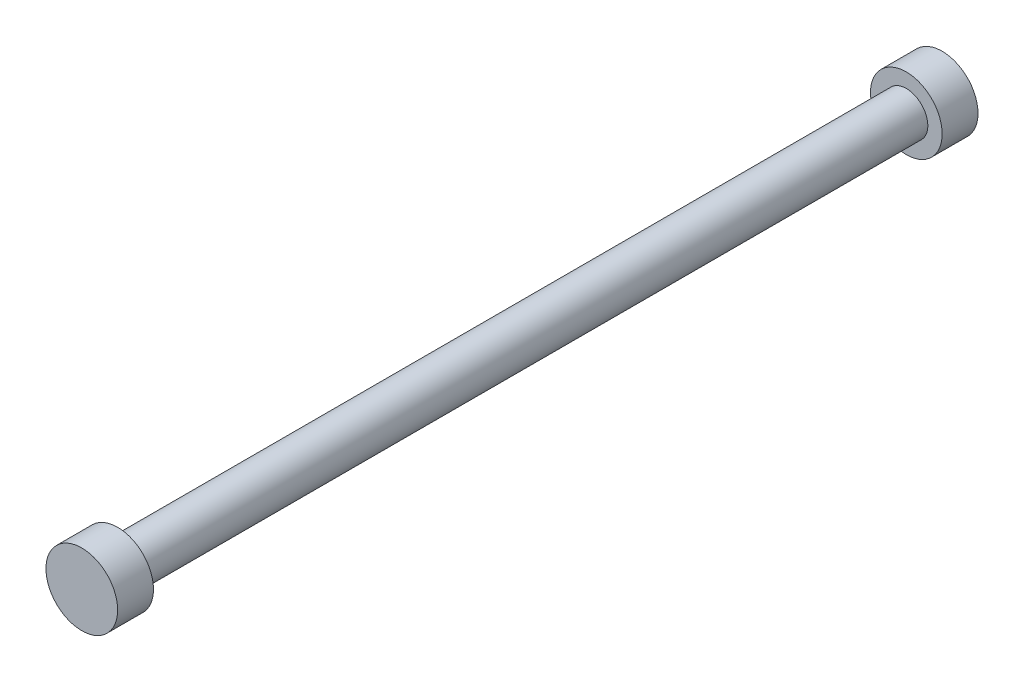
ISO-10303-21;
HEADER;
FILE_DESCRIPTION(('STEP AP214'),'2;1');
FILE_NAME('part.step','',(''),(''),'','','');
FILE_SCHEMA(('AUTOMOTIVE_DESIGN { 1 0 10303 214 1 1 1 1 }'));
ENDSEC;
DATA;
#1=APPLICATION_CONTEXT('core data for automotive mechanical design processes');
#2=APPLICATION_PROTOCOL_DEFINITION('international standard','automotive_design',2000,#1);
#3=PRODUCT_CONTEXT('',#1,'mechanical');
#4=PRODUCT('Part','Part','',(#3));
#5=PRODUCT_RELATED_PRODUCT_CATEGORY('part','',(#4));
#6=PRODUCT_DEFINITION_FORMATION('','',#4);
#7=PRODUCT_DEFINITION_CONTEXT('part definition',#1,'design');
#8=PRODUCT_DEFINITION('design','',#6,#7);
#9=PRODUCT_DEFINITION_SHAPE('','',#8);
#10=(LENGTH_UNIT() NAMED_UNIT(*) SI_UNIT(.MILLI.,.METRE.));
#11=(NAMED_UNIT(*) PLANE_ANGLE_UNIT() SI_UNIT($,.RADIAN.));
#12=(NAMED_UNIT(*) SI_UNIT($,.STERADIAN.) SOLID_ANGLE_UNIT());
#13=UNCERTAINTY_MEASURE_WITH_UNIT(LENGTH_MEASURE(1.E-05),#10,'distance_accuracy_value','');
#14=(GEOMETRIC_REPRESENTATION_CONTEXT(3) GLOBAL_UNCERTAINTY_ASSIGNED_CONTEXT((#13)) GLOBAL_UNIT_ASSIGNED_CONTEXT((#10,
#11,#12)) REPRESENTATION_CONTEXT('',''));
#15=CARTESIAN_POINT('',(0.,0.,0.));
#16=DIRECTION('',(0.,0.,1.));
#17=DIRECTION('',(1.,0.,0.));
#18=AXIS2_PLACEMENT_3D('',#15,#16,#17);
#19=CARTESIAN_POINT('',(0.,0.,57.5));
#20=DIRECTION('',(0.,0.,-1.));
#21=DIRECTION('',(-1.,0.,0.));
#22=AXIS2_PLACEMENT_3D('',#19,#20,#21);
#23=CYLINDRICAL_SURFACE('',#22,3.);
#24=CARTESIAN_POINT('',(0.,0.,55.));
#25=DIRECTION('',(0.,0.,1.));
#26=DIRECTION('',(1.,0.,0.));
#27=AXIS2_PLACEMENT_3D('',#24,#25,#26);
#28=CIRCLE('',#27,3.);
#29=CARTESIAN_POINT('',(3.,0.,55.));
#30=VERTEX_POINT('',#29);
#31=EDGE_CURVE('E41',#30,#30,#28,.T.);
#32=ORIENTED_EDGE('',*,*,#31,.F.);
#33=EDGE_LOOP('',(#32));
#34=FACE_BOUND('',#33,.T.);
#35=CARTESIAN_POINT('',(0.,0.,-55.));
#36=DIRECTION('',(0.,0.,-1.));
#37=DIRECTION('',(-1.,0.,0.));
#38=AXIS2_PLACEMENT_3D('',#35,#36,#37);
#39=CIRCLE('',#38,3.);
#40=CARTESIAN_POINT('',(-3.,0.,-55.));
#41=VERTEX_POINT('',#40);
#42=EDGE_CURVE('E10',#41,#41,#39,.T.);
#43=ORIENTED_EDGE('',*,*,#42,.F.);
#44=EDGE_LOOP('',(#43));
#45=FACE_BOUND('',#44,.T.);
#46=ADVANCED_FACE('F35',(#34,#45),#23,.T.);
#47=CARTESIAN_POINT('',(0.,0.,60.));
#48=DIRECTION('',(0.,0.,-1.));
#49=DIRECTION('',(-1.,0.,0.));
#50=AXIS2_PLACEMENT_3D('',#47,#48,#49);
#51=CYLINDRICAL_SURFACE('',#50,5.);
#52=CARTESIAN_POINT('',(0.,0.,60.));
#53=DIRECTION('',(0.,0.,1.));
#54=DIRECTION('',(1.,0.,0.));
#55=AXIS2_PLACEMENT_3D('',#52,#53,#54);
#56=CIRCLE('',#55,5.);
#57=CARTESIAN_POINT('',(5.,0.,60.));
#58=VERTEX_POINT('',#57);
#59=EDGE_CURVE('E45',#58,#58,#56,.T.);
#60=ORIENTED_EDGE('',*,*,#59,.F.);
#61=EDGE_LOOP('',(#60));
#62=FACE_BOUND('',#61,.T.);
#63=CARTESIAN_POINT('',(0.,0.,55.));
#64=DIRECTION('',(0.,0.,1.));
#65=DIRECTION('',(1.,0.,0.));
#66=AXIS2_PLACEMENT_3D('',#63,#64,#65);
#67=CIRCLE('',#66,5.);
#68=CARTESIAN_POINT('',(5.,0.,55.));
#69=VERTEX_POINT('',#68);
#70=EDGE_CURVE('E49',#69,#69,#67,.T.);
#71=ORIENTED_EDGE('',*,*,#70,.T.);
#72=EDGE_LOOP('',(#71));
#73=FACE_BOUND('',#72,.T.);
#74=ADVANCED_FACE('F76',(#62,#73),#51,.T.);
#75=CARTESIAN_POINT('',(0.,0.,60.));
#76=DIRECTION('',(0.,0.,1.));
#77=DIRECTION('',(1.,0.,0.));
#78=AXIS2_PLACEMENT_3D('',#75,#76,#77);
#79=PLANE('',#78);
#80=ORIENTED_EDGE('',*,*,#59,.T.);
#81=EDGE_LOOP('',(#80));
#82=FACE_BOUND('',#81,.T.);
#83=ADVANCED_FACE('F81',(#82),#79,.T.);
#84=CARTESIAN_POINT('',(0.,0.,55.));
#85=DIRECTION('',(0.,0.,1.));
#86=DIRECTION('',(1.,0.,0.));
#87=AXIS2_PLACEMENT_3D('',#84,#85,#86);
#88=PLANE('',#87);
#89=ORIENTED_EDGE('',*,*,#31,.T.);
#90=EDGE_LOOP('',(#89));
#91=FACE_BOUND('',#90,.T.);
#92=ORIENTED_EDGE('',*,*,#70,.F.);
#93=EDGE_LOOP('',(#92));
#94=FACE_BOUND('',#93,.T.);
#95=ADVANCED_FACE('F73',(#91,#94),#88,.F.);
#96=CARTESIAN_POINT('',(0.,0.,-60.));
#97=DIRECTION('',(0.,0.,1.));
#98=DIRECTION('',(1.,0.,0.));
#99=AXIS2_PLACEMENT_3D('',#96,#97,#98);
#100=CYLINDRICAL_SURFACE('',#99,5.);
#101=CARTESIAN_POINT('',(0.,0.,-60.));
#102=DIRECTION('',(0.,0.,1.));
#103=DIRECTION('',(1.,0.,0.));
#104=AXIS2_PLACEMENT_3D('',#101,#102,#103);
#105=CIRCLE('',#104,5.);
#106=CARTESIAN_POINT('',(5.,0.,-60.));
#107=VERTEX_POINT('',#106);
#108=EDGE_CURVE('E53',#107,#107,#105,.T.);
#109=ORIENTED_EDGE('',*,*,#108,.T.);
#110=EDGE_LOOP('',(#109));
#111=FACE_BOUND('',#110,.T.);
#112=CARTESIAN_POINT('',(0.,0.,-55.));
#113=DIRECTION('',(0.,0.,1.));
#114=DIRECTION('',(1.,0.,0.));
#115=AXIS2_PLACEMENT_3D('',#112,#113,#114);
#116=CIRCLE('',#115,5.);
#117=CARTESIAN_POINT('',(5.,0.,-55.));
#118=VERTEX_POINT('',#117);
#119=EDGE_CURVE('E55',#118,#118,#116,.T.);
#120=ORIENTED_EDGE('',*,*,#119,.F.);
#121=EDGE_LOOP('',(#120));
#122=FACE_BOUND('',#121,.T.);
#123=ADVANCED_FACE('F61',(#111,#122),#100,.T.);
#124=CARTESIAN_POINT('',(0.,0.,-60.));
#125=DIRECTION('',(0.,0.,-1.));
#126=DIRECTION('',(1.,0.,0.));
#127=AXIS2_PLACEMENT_3D('',#124,#125,#126);
#128=PLANE('',#127);
#129=ORIENTED_EDGE('',*,*,#108,.F.);
#130=EDGE_LOOP('',(#129));
#131=FACE_BOUND('',#130,.T.);
#132=ADVANCED_FACE('F64',(#131),#128,.T.);
#133=CARTESIAN_POINT('',(0.,0.,-55.));
#134=DIRECTION('',(0.,0.,-1.));
#135=DIRECTION('',(1.,0.,0.));
#136=AXIS2_PLACEMENT_3D('',#133,#134,#135);
#137=PLANE('',#136);
#138=ORIENTED_EDGE('',*,*,#42,.T.);
#139=EDGE_LOOP('',(#138));
#140=FACE_BOUND('',#139,.T.);
#141=ORIENTED_EDGE('',*,*,#119,.T.);
#142=EDGE_LOOP('',(#141));
#143=FACE_BOUND('',#142,.T.);
#144=ADVANCED_FACE('F66',(#140,#143),#137,.F.);
#145=CLOSED_SHELL('',(#46,#74,#83,#95,#123,#132,#144));
#146=MANIFOLD_SOLID_BREP('B2',#145);
#147=ADVANCED_BREP_SHAPE_REPRESENTATION('',(#18,#146),#14);
#148=SHAPE_DEFINITION_REPRESENTATION(#9,#147);
ENDSEC;
END-ISO-10303-21;
